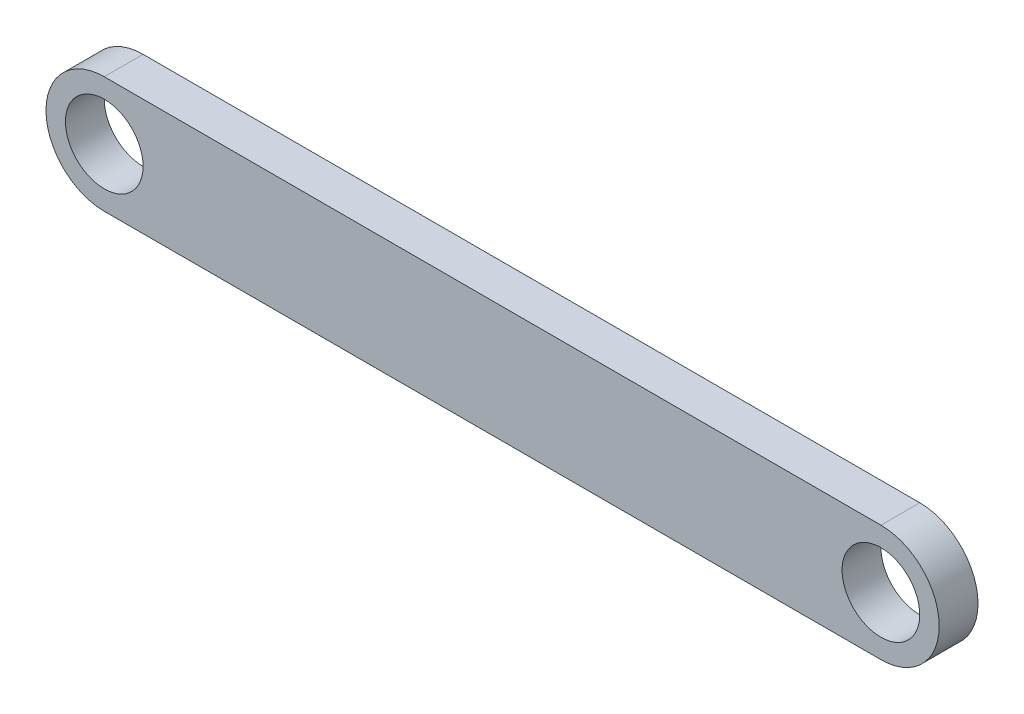
ISO-10303-21;
HEADER;
FILE_DESCRIPTION(('STEP AP214'),'2;1');
FILE_NAME('part.step','',(''),(''),'','','');
FILE_SCHEMA(('AUTOMOTIVE_DESIGN { 1 0 10303 214 1 1 1 1 }'));
ENDSEC;
DATA;
#1=APPLICATION_CONTEXT('core data for automotive mechanical design processes');
#2=APPLICATION_PROTOCOL_DEFINITION('international standard','automotive_design',2000,#1);
#3=PRODUCT_CONTEXT('',#1,'mechanical');
#4=PRODUCT('Part','Part','',(#3));
#5=PRODUCT_RELATED_PRODUCT_CATEGORY('part','',(#4));
#6=PRODUCT_DEFINITION_FORMATION('','',#4);
#7=PRODUCT_DEFINITION_CONTEXT('part definition',#1,'design');
#8=PRODUCT_DEFINITION('design','',#6,#7);
#9=PRODUCT_DEFINITION_SHAPE('','',#8);
#10=(LENGTH_UNIT() NAMED_UNIT(*) SI_UNIT(.MILLI.,.METRE.));
#11=(NAMED_UNIT(*) PLANE_ANGLE_UNIT() SI_UNIT($,.RADIAN.));
#12=(NAMED_UNIT(*) SI_UNIT($,.STERADIAN.) SOLID_ANGLE_UNIT());
#13=UNCERTAINTY_MEASURE_WITH_UNIT(LENGTH_MEASURE(1.E-05),#10,'distance_accuracy_value','');
#14=(GEOMETRIC_REPRESENTATION_CONTEXT(3) GLOBAL_UNCERTAINTY_ASSIGNED_CONTEXT((#13)) GLOBAL_UNIT_ASSIGNED_CONTEXT((#10,
#11,#12)) REPRESENTATION_CONTEXT('',''));
#15=CARTESIAN_POINT('',(0.,0.,0.));
#16=DIRECTION('',(0.,0.,1.));
#17=DIRECTION('',(1.,0.,0.));
#18=AXIS2_PLACEMENT_3D('',#15,#16,#17);
#19=CARTESIAN_POINT('',(-31.8000553096727,0.,10.));
#20=DIRECTION('',(0.,0.,1.));
#21=DIRECTION('',(1.,0.,0.));
#22=AXIS2_PLACEMENT_3D('',#19,#20,#21);
#23=PLANE('',#22);
#24=CARTESIAN_POINT('',(-31.8000553096727,0.,10.));
#25=DIRECTION('',(0.,0.,1.));
#26=DIRECTION('',(1.,0.,0.));
#27=AXIS2_PLACEMENT_3D('',#24,#25,#26);
#28=CIRCLE('',#27,10.);
#29=CARTESIAN_POINT('',(-21.8000553096727,0.,10.));
#30=VERTEX_POINT('',#29);
#31=EDGE_CURVE('E99',#30,#30,#28,.T.);
#32=ORIENTED_EDGE('',*,*,#31,.F.);
#33=EDGE_LOOP('',(#32));
#34=FACE_BOUND('',#33,.T.);
#35=CARTESIAN_POINT('',(-31.8000553096727,0.,10.));
#36=DIRECTION('',(0.,0.,1.));
#37=DIRECTION('',(1.,0.,0.));
#38=AXIS2_PLACEMENT_3D('',#35,#36,#37);
#39=CIRCLE('',#38,15.);
#40=CARTESIAN_POINT('',(-31.8000553096727,15.,10.));
#41=VERTEX_POINT('',#40);
#42=CARTESIAN_POINT('',(-31.8000553096727,-15.,10.));
#43=VERTEX_POINT('',#42);
#44=EDGE_CURVE('E84',#41,#43,#39,.T.);
#45=ORIENTED_EDGE('',*,*,#44,.T.);
#46=DIRECTION('',(1.,0.,0.));
#47=VECTOR('',#46,1.);
#48=CARTESIAN_POINT('',(-31.8000553096727,-15.,10.));
#49=LINE('',#48,#47);
#50=CARTESIAN_POINT('',(168.199944690327,-15.,10.));
#51=VERTEX_POINT('',#50);
#52=EDGE_CURVE('E79',#43,#51,#49,.T.);
#53=ORIENTED_EDGE('',*,*,#52,.T.);
#54=CARTESIAN_POINT('',(168.199944690327,0.,10.));
#55=DIRECTION('',(0.,0.,1.));
#56=DIRECTION('',(1.,0.,0.));
#57=AXIS2_PLACEMENT_3D('',#54,#55,#56);
#58=CIRCLE('',#57,15.);
#59=CARTESIAN_POINT('',(168.199944690327,15.,10.));
#60=VERTEX_POINT('',#59);
#61=EDGE_CURVE('E82',#51,#60,#58,.T.);
#62=ORIENTED_EDGE('',*,*,#61,.T.);
#63=DIRECTION('',(-1.,0.,0.));
#64=VECTOR('',#63,1.);
#65=CARTESIAN_POINT('',(-31.8000553096727,15.,10.));
#66=LINE('',#65,#64);
#67=EDGE_CURVE('E49',#60,#41,#66,.T.);
#68=ORIENTED_EDGE('',*,*,#67,.T.);
#69=EDGE_LOOP('',(#45,#53,#62,#68));
#70=FACE_BOUND('',#69,.T.);
#71=CARTESIAN_POINT('',(168.199944690327,0.,10.));
#72=DIRECTION('',(0.,0.,1.));
#73=DIRECTION('',(1.,0.,0.));
#74=AXIS2_PLACEMENT_3D('',#71,#72,#73);
#75=CIRCLE('',#74,10.);
#76=CARTESIAN_POINT('',(178.199944690327,0.,10.));
#77=VERTEX_POINT('',#76);
#78=EDGE_CURVE('E114',#77,#77,#75,.T.);
#79=ORIENTED_EDGE('',*,*,#78,.F.);
#80=EDGE_LOOP('',(#79));
#81=FACE_BOUND('',#80,.T.);
#82=ADVANCED_FACE('F32',(#34,#70,#81),#23,.T.);
#83=CARTESIAN_POINT('',(-31.8000553096727,0.,0.));
#84=DIRECTION('',(0.,0.,1.));
#85=DIRECTION('',(1.,0.,0.));
#86=AXIS2_PLACEMENT_3D('',#83,#84,#85);
#87=PLANE('',#86);
#88=CARTESIAN_POINT('',(-31.8000553096727,0.,0.));
#89=DIRECTION('',(0.,0.,1.));
#90=DIRECTION('',(1.,0.,0.));
#91=AXIS2_PLACEMENT_3D('',#88,#89,#90);
#92=CIRCLE('',#91,15.);
#93=CARTESIAN_POINT('',(-31.8000553096727,15.,0.));
#94=VERTEX_POINT('',#93);
#95=CARTESIAN_POINT('',(-31.8000553096727,-15.,0.));
#96=VERTEX_POINT('',#95);
#97=EDGE_CURVE('E96',#94,#96,#92,.T.);
#98=ORIENTED_EDGE('',*,*,#97,.F.);
#99=DIRECTION('',(-1.,0.,0.));
#100=VECTOR('',#99,1.);
#101=CARTESIAN_POINT('',(-31.8000553096727,15.,0.));
#102=LINE('',#101,#100);
#103=CARTESIAN_POINT('',(168.199944690327,15.,0.));
#104=VERTEX_POINT('',#103);
#105=EDGE_CURVE('E72',#104,#94,#102,.T.);
#106=ORIENTED_EDGE('',*,*,#105,.F.);
#107=CARTESIAN_POINT('',(168.199944690327,0.,0.));
#108=DIRECTION('',(0.,0.,1.));
#109=DIRECTION('',(1.,0.,0.));
#110=AXIS2_PLACEMENT_3D('',#107,#108,#109);
#111=CIRCLE('',#110,15.);
#112=CARTESIAN_POINT('',(168.199944690327,-15.,0.));
#113=VERTEX_POINT('',#112);
#114=EDGE_CURVE('E66',#113,#104,#111,.T.);
#115=ORIENTED_EDGE('',*,*,#114,.F.);
#116=DIRECTION('',(1.,0.,0.));
#117=VECTOR('',#116,1.);
#118=CARTESIAN_POINT('',(-31.8000553096727,-15.,0.));
#119=LINE('',#118,#117);
#120=EDGE_CURVE('E88',#96,#113,#119,.T.);
#121=ORIENTED_EDGE('',*,*,#120,.F.);
#122=EDGE_LOOP('',(#98,#106,#115,#121));
#123=FACE_BOUND('',#122,.T.);
#124=CARTESIAN_POINT('',(-31.8000553096727,0.,0.));
#125=DIRECTION('',(0.,0.,1.));
#126=DIRECTION('',(1.,0.,0.));
#127=AXIS2_PLACEMENT_3D('',#124,#125,#126);
#128=CIRCLE('',#127,10.);
#129=CARTESIAN_POINT('',(-21.8000553096727,0.,0.));
#130=VERTEX_POINT('',#129);
#131=EDGE_CURVE('E111',#130,#130,#128,.T.);
#132=ORIENTED_EDGE('',*,*,#131,.T.);
#133=EDGE_LOOP('',(#132));
#134=FACE_BOUND('',#133,.T.);
#135=CARTESIAN_POINT('',(168.199944690327,0.,0.));
#136=DIRECTION('',(0.,0.,1.));
#137=DIRECTION('',(1.,0.,0.));
#138=AXIS2_PLACEMENT_3D('',#135,#136,#137);
#139=CIRCLE('',#138,10.);
#140=CARTESIAN_POINT('',(178.199944690327,0.,0.));
#141=VERTEX_POINT('',#140);
#142=EDGE_CURVE('E117',#141,#141,#139,.T.);
#143=ORIENTED_EDGE('',*,*,#142,.T.);
#144=EDGE_LOOP('',(#143));
#145=FACE_BOUND('',#144,.T.);
#146=ADVANCED_FACE('F107',(#123,#134,#145),#87,.F.);
#147=CARTESIAN_POINT('',(-31.8000553096727,0.,10.));
#148=DIRECTION('',(0.,0.,-1.));
#149=DIRECTION('',(-1.,0.,0.));
#150=AXIS2_PLACEMENT_3D('',#147,#148,#149);
#151=CYLINDRICAL_SURFACE('',#150,15.);
#152=ORIENTED_EDGE('',*,*,#97,.T.);
#153=DIRECTION('',(0.,0.,-1.));
#154=VECTOR('',#153,1.);
#155=CARTESIAN_POINT('',(-31.8000553096727,-15.,10.));
#156=LINE('',#155,#154);
#157=EDGE_CURVE('E11',#43,#96,#156,.T.);
#158=ORIENTED_EDGE('',*,*,#157,.F.);
#159=ORIENTED_EDGE('',*,*,#44,.F.);
#160=DIRECTION('',(0.,0.,-1.));
#161=VECTOR('',#160,1.);
#162=CARTESIAN_POINT('',(-31.8000553096727,15.,10.));
#163=LINE('',#162,#161);
#164=EDGE_CURVE('E92',#41,#94,#163,.T.);
#165=ORIENTED_EDGE('',*,*,#164,.T.);
#166=EDGE_LOOP('',(#152,#158,#159,#165));
#167=FACE_BOUND('',#166,.T.);
#168=ADVANCED_FACE('F34',(#167),#151,.T.);
#169=CARTESIAN_POINT('',(-31.8000553096727,-15.,10.));
#170=DIRECTION('',(0.,1.,0.));
#171=DIRECTION('',(0.,0.,1.));
#172=AXIS2_PLACEMENT_3D('',#169,#170,#171);
#173=PLANE('',#172);
#174=ORIENTED_EDGE('',*,*,#120,.T.);
#175=DIRECTION('',(0.,0.,-1.));
#176=VECTOR('',#175,1.);
#177=CARTESIAN_POINT('',(168.199944690327,-15.,10.));
#178=LINE('',#177,#176);
#179=EDGE_CURVE('E41',#51,#113,#178,.T.);
#180=ORIENTED_EDGE('',*,*,#179,.F.);
#181=ORIENTED_EDGE('',*,*,#52,.F.);
#182=ORIENTED_EDGE('',*,*,#157,.T.);
#183=EDGE_LOOP('',(#174,#180,#181,#182));
#184=FACE_BOUND('',#183,.T.);
#185=ADVANCED_FACE('F87',(#184),#173,.F.);
#186=CARTESIAN_POINT('',(168.199944690327,0.,10.));
#187=DIRECTION('',(0.,0.,-1.));
#188=DIRECTION('',(-1.,0.,0.));
#189=AXIS2_PLACEMENT_3D('',#186,#187,#188);
#190=CYLINDRICAL_SURFACE('',#189,15.);
#191=ORIENTED_EDGE('',*,*,#114,.T.);
#192=DIRECTION('',(0.,0.,-1.));
#193=VECTOR('',#192,1.);
#194=CARTESIAN_POINT('',(168.199944690327,15.,10.));
#195=LINE('',#194,#193);
#196=EDGE_CURVE('E89',#60,#104,#195,.T.);
#197=ORIENTED_EDGE('',*,*,#196,.F.);
#198=ORIENTED_EDGE('',*,*,#61,.F.);
#199=ORIENTED_EDGE('',*,*,#179,.T.);
#200=EDGE_LOOP('',(#191,#197,#198,#199));
#201=FACE_BOUND('',#200,.T.);
#202=ADVANCED_FACE('F90',(#201),#190,.T.);
#203=CARTESIAN_POINT('',(-31.8000553096727,15.,10.));
#204=DIRECTION('',(0.,-1.,0.));
#205=DIRECTION('',(0.,0.,-1.));
#206=AXIS2_PLACEMENT_3D('',#203,#204,#205);
#207=PLANE('',#206);
#208=ORIENTED_EDGE('',*,*,#105,.T.);
#209=ORIENTED_EDGE('',*,*,#164,.F.);
#210=ORIENTED_EDGE('',*,*,#67,.F.);
#211=ORIENTED_EDGE('',*,*,#196,.T.);
#212=EDGE_LOOP('',(#208,#209,#210,#211));
#213=FACE_BOUND('',#212,.T.);
#214=ADVANCED_FACE('F104',(#213),#207,.F.);
#215=CARTESIAN_POINT('',(-31.8000553096727,0.,10.));
#216=DIRECTION('',(0.,0.,-1.));
#217=DIRECTION('',(-1.,0.,0.));
#218=AXIS2_PLACEMENT_3D('',#215,#216,#217);
#219=CYLINDRICAL_SURFACE('',#218,10.);
#220=ORIENTED_EDGE('',*,*,#31,.T.);
#221=EDGE_LOOP('',(#220));
#222=FACE_BOUND('',#221,.T.);
#223=ORIENTED_EDGE('',*,*,#131,.F.);
#224=EDGE_LOOP('',(#223));
#225=FACE_BOUND('',#224,.T.);
#226=ADVANCED_FACE('F134',(#222,#225),#219,.F.);
#227=CARTESIAN_POINT('',(168.199944690327,0.,10.));
#228=DIRECTION('',(0.,0.,-1.));
#229=DIRECTION('',(-1.,0.,0.));
#230=AXIS2_PLACEMENT_3D('',#227,#228,#229);
#231=CYLINDRICAL_SURFACE('',#230,10.);
#232=ORIENTED_EDGE('',*,*,#78,.T.);
#233=EDGE_LOOP('',(#232));
#234=FACE_BOUND('',#233,.T.);
#235=ORIENTED_EDGE('',*,*,#142,.F.);
#236=EDGE_LOOP('',(#235));
#237=FACE_BOUND('',#236,.T.);
#238=ADVANCED_FACE('F123',(#234,#237),#231,.F.);
#239=CLOSED_SHELL('',(#82,#146,#168,#185,#202,#214,#226,#238));
#240=MANIFOLD_SOLID_BREP('B2',#239);
#241=ADVANCED_BREP_SHAPE_REPRESENTATION('',(#18,#240),#14);
#242=SHAPE_DEFINITION_REPRESENTATION(#9,#241);
ENDSEC;
END-ISO-10303-21;
